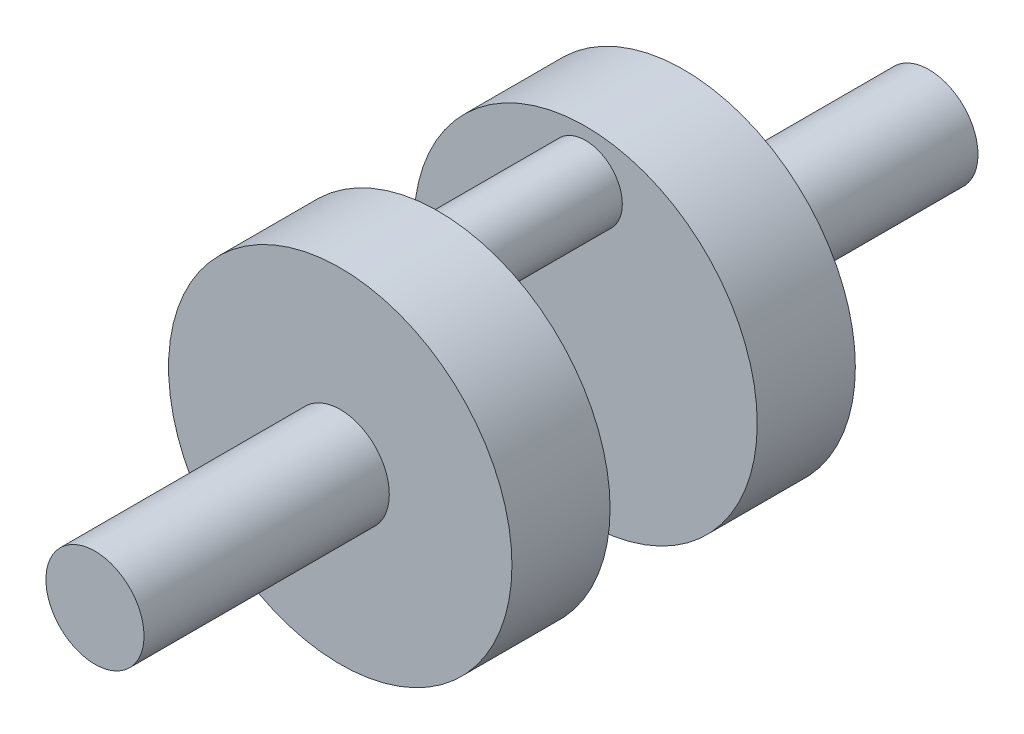
ISO-10303-21;
HEADER;
FILE_DESCRIPTION(('STEP AP214'),'2;1');
FILE_NAME('part.step','',(''),(''),'','','');
FILE_SCHEMA(('AUTOMOTIVE_DESIGN { 1 0 10303 214 1 1 1 1 }'));
ENDSEC;
DATA;
#1=APPLICATION_CONTEXT('core data for automotive mechanical design processes');
#2=APPLICATION_PROTOCOL_DEFINITION('international standard','automotive_design',2000,#1);
#3=PRODUCT_CONTEXT('',#1,'mechanical');
#4=PRODUCT('Part','Part','',(#3));
#5=PRODUCT_RELATED_PRODUCT_CATEGORY('part','',(#4));
#6=PRODUCT_DEFINITION_FORMATION('','',#4);
#7=PRODUCT_DEFINITION_CONTEXT('part definition',#1,'design');
#8=PRODUCT_DEFINITION('design','',#6,#7);
#9=PRODUCT_DEFINITION_SHAPE('','',#8);
#10=(LENGTH_UNIT() NAMED_UNIT(*) SI_UNIT(.MILLI.,.METRE.));
#11=(NAMED_UNIT(*) PLANE_ANGLE_UNIT() SI_UNIT($,.RADIAN.));
#12=(NAMED_UNIT(*) SI_UNIT($,.STERADIAN.) SOLID_ANGLE_UNIT());
#13=UNCERTAINTY_MEASURE_WITH_UNIT(LENGTH_MEASURE(1.E-05),#10,'distance_accuracy_value','');
#14=(GEOMETRIC_REPRESENTATION_CONTEXT(3) GLOBAL_UNCERTAINTY_ASSIGNED_CONTEXT((#13)) GLOBAL_UNIT_ASSIGNED_CONTEXT((#10,
#11,#12)) REPRESENTATION_CONTEXT('',''));
#15=CARTESIAN_POINT('',(0.,0.,0.));
#16=DIRECTION('',(0.,0.,1.));
#17=DIRECTION('',(1.,0.,0.));
#18=AXIS2_PLACEMENT_3D('',#15,#16,#17);
#19=CARTESIAN_POINT('',(0.,25.,-30.));
#20=DIRECTION('',(0.,0.,1.));
#21=DIRECTION('',(1.,0.,0.));
#22=AXIS2_PLACEMENT_3D('',#19,#20,#21);
#23=CYLINDRICAL_SURFACE('',#22,7.5);
#24=CARTESIAN_POINT('',(0.,25.,-30.));
#25=DIRECTION('',(0.,0.,1.));
#26=DIRECTION('',(1.,0.,0.));
#27=AXIS2_PLACEMENT_3D('',#24,#25,#26);
#28=CIRCLE('',#27,7.5);
#29=CARTESIAN_POINT('',(7.5,25.,-30.));
#30=VERTEX_POINT('',#29);
#31=EDGE_CURVE('E62',#30,#30,#28,.T.);
#32=ORIENTED_EDGE('',*,*,#31,.T.);
#33=EDGE_LOOP('',(#32));
#34=FACE_BOUND('',#33,.T.);
#35=CARTESIAN_POINT('',(0.,25.,0.));
#36=DIRECTION('',(0.,0.,1.));
#37=DIRECTION('',(1.,0.,0.));
#38=AXIS2_PLACEMENT_3D('',#35,#36,#37);
#39=CIRCLE('',#38,7.5);
#40=CARTESIAN_POINT('',(7.5,25.,0.));
#41=VERTEX_POINT('',#40);
#42=EDGE_CURVE('E11',#41,#41,#39,.T.);
#43=ORIENTED_EDGE('',*,*,#42,.F.);
#44=EDGE_LOOP('',(#43));
#45=FACE_BOUND('',#44,.T.);
#46=ADVANCED_FACE('F42',(#34,#45),#23,.T.);
#47=CARTESIAN_POINT('',(0.,0.,20.));
#48=DIRECTION('',(0.,0.,-1.));
#49=DIRECTION('',(-1.,0.,0.));
#50=AXIS2_PLACEMENT_3D('',#47,#48,#49);
#51=CYLINDRICAL_SURFACE('',#50,35.);
#52=CARTESIAN_POINT('',(0.,0.,20.));
#53=DIRECTION('',(0.,0.,1.));
#54=DIRECTION('',(1.,0.,0.));
#55=AXIS2_PLACEMENT_3D('',#52,#53,#54);
#56=CIRCLE('',#55,35.);
#57=CARTESIAN_POINT('',(35.,0.,20.));
#58=VERTEX_POINT('',#57);
#59=EDGE_CURVE('E48',#58,#58,#56,.T.);
#60=ORIENTED_EDGE('',*,*,#59,.F.);
#61=EDGE_LOOP('',(#60));
#62=FACE_BOUND('',#61,.T.);
#63=CARTESIAN_POINT('',(0.,0.,0.));
#64=DIRECTION('',(0.,0.,1.));
#65=DIRECTION('',(1.,0.,0.));
#66=AXIS2_PLACEMENT_3D('',#63,#64,#65);
#67=CIRCLE('',#66,35.);
#68=CARTESIAN_POINT('',(35.,0.,0.));
#69=VERTEX_POINT('',#68);
#70=EDGE_CURVE('E57',#69,#69,#67,.T.);
#71=ORIENTED_EDGE('',*,*,#70,.T.);
#72=EDGE_LOOP('',(#71));
#73=FACE_BOUND('',#72,.T.);
#74=ADVANCED_FACE('F96',(#62,#73),#51,.T.);
#75=CARTESIAN_POINT('',(0.,0.,20.));
#76=DIRECTION('',(0.,0.,1.));
#77=DIRECTION('',(1.,0.,0.));
#78=AXIS2_PLACEMENT_3D('',#75,#76,#77);
#79=PLANE('',#78);
#80=CARTESIAN_POINT('',(0.,0.,20.));
#81=DIRECTION('',(0.,0.,1.));
#82=DIRECTION('',(1.,0.,0.));
#83=AXIS2_PLACEMENT_3D('',#80,#81,#82);
#84=CIRCLE('',#83,10.);
#85=CARTESIAN_POINT('',(10.,0.,20.));
#86=VERTEX_POINT('',#85);
#87=EDGE_CURVE('E52',#86,#86,#84,.T.);
#88=ORIENTED_EDGE('',*,*,#87,.F.);
#89=EDGE_LOOP('',(#88));
#90=FACE_BOUND('',#89,.T.);
#91=ORIENTED_EDGE('',*,*,#59,.T.);
#92=EDGE_LOOP('',(#91));
#93=FACE_BOUND('',#92,.T.);
#94=ADVANCED_FACE('F100',(#90,#93),#79,.T.);
#95=CARTESIAN_POINT('',(0.,0.,0.));
#96=DIRECTION('',(0.,0.,1.));
#97=DIRECTION('',(1.,0.,0.));
#98=AXIS2_PLACEMENT_3D('',#95,#96,#97);
#99=PLANE('',#98);
#100=ORIENTED_EDGE('',*,*,#42,.T.);
#101=EDGE_LOOP('',(#100));
#102=FACE_BOUND('',#101,.T.);
#103=ORIENTED_EDGE('',*,*,#70,.F.);
#104=EDGE_LOOP('',(#103));
#105=FACE_BOUND('',#104,.T.);
#106=ADVANCED_FACE('F106',(#102,#105),#99,.F.);
#107=CARTESIAN_POINT('',(0.,0.,-50.));
#108=DIRECTION('',(0.,0.,1.));
#109=DIRECTION('',(1.,0.,0.));
#110=AXIS2_PLACEMENT_3D('',#107,#108,#109);
#111=CYLINDRICAL_SURFACE('',#110,35.);
#112=CARTESIAN_POINT('',(0.,0.,-50.));
#113=DIRECTION('',(0.,0.,1.));
#114=DIRECTION('',(1.,0.,0.));
#115=AXIS2_PLACEMENT_3D('',#112,#113,#114);
#116=CIRCLE('',#115,35.);
#117=CARTESIAN_POINT('',(35.,0.,-50.));
#118=VERTEX_POINT('',#117);
#119=EDGE_CURVE('E64',#118,#118,#116,.T.);
#120=ORIENTED_EDGE('',*,*,#119,.T.);
#121=EDGE_LOOP('',(#120));
#122=FACE_BOUND('',#121,.T.);
#123=CARTESIAN_POINT('',(0.,0.,-30.));
#124=DIRECTION('',(0.,0.,1.));
#125=DIRECTION('',(1.,0.,0.));
#126=AXIS2_PLACEMENT_3D('',#123,#124,#125);
#127=CIRCLE('',#126,35.);
#128=CARTESIAN_POINT('',(35.,0.,-30.));
#129=VERTEX_POINT('',#128);
#130=EDGE_CURVE('E68',#129,#129,#127,.T.);
#131=ORIENTED_EDGE('',*,*,#130,.F.);
#132=EDGE_LOOP('',(#131));
#133=FACE_BOUND('',#132,.T.);
#134=ADVANCED_FACE('F112',(#122,#133),#111,.T.);
#135=CARTESIAN_POINT('',(0.,0.,-50.));
#136=DIRECTION('',(0.,0.,1.));
#137=DIRECTION('',(1.,0.,0.));
#138=AXIS2_PLACEMENT_3D('',#135,#136,#137);
#139=PLANE('',#138);
#140=CARTESIAN_POINT('',(0.,0.,-50.));
#141=DIRECTION('',(0.,0.,1.));
#142=DIRECTION('',(1.,0.,0.));
#143=AXIS2_PLACEMENT_3D('',#140,#141,#142);
#144=CIRCLE('',#143,10.);
#145=CARTESIAN_POINT('',(10.,0.,-50.));
#146=VERTEX_POINT('',#145);
#147=EDGE_CURVE('E77',#146,#146,#144,.T.);
#148=ORIENTED_EDGE('',*,*,#147,.T.);
#149=EDGE_LOOP('',(#148));
#150=FACE_BOUND('',#149,.T.);
#151=ORIENTED_EDGE('',*,*,#119,.F.);
#152=EDGE_LOOP('',(#151));
#153=FACE_BOUND('',#152,.T.);
#154=ADVANCED_FACE('F116',(#150,#153),#139,.F.);
#155=CARTESIAN_POINT('',(0.,0.,-30.));
#156=DIRECTION('',(0.,0.,1.));
#157=DIRECTION('',(1.,0.,0.));
#158=AXIS2_PLACEMENT_3D('',#155,#156,#157);
#159=PLANE('',#158);
#160=ORIENTED_EDGE('',*,*,#31,.F.);
#161=EDGE_LOOP('',(#160));
#162=FACE_BOUND('',#161,.T.);
#163=ORIENTED_EDGE('',*,*,#130,.T.);
#164=EDGE_LOOP('',(#163));
#165=FACE_BOUND('',#164,.T.);
#166=ADVANCED_FACE('F117',(#162,#165),#159,.T.);
#167=CARTESIAN_POINT('',(0.,0.,70.));
#168=DIRECTION('',(0.,0.,-1.));
#169=DIRECTION('',(-1.,0.,0.));
#170=AXIS2_PLACEMENT_3D('',#167,#168,#169);
#171=CYLINDRICAL_SURFACE('',#170,10.);
#172=ORIENTED_EDGE('',*,*,#87,.T.);
#173=EDGE_LOOP('',(#172));
#174=FACE_BOUND('',#173,.T.);
#175=CARTESIAN_POINT('',(0.,0.,70.));
#176=DIRECTION('',(0.,0.,1.));
#177=DIRECTION('',(1.,0.,0.));
#178=AXIS2_PLACEMENT_3D('',#175,#176,#177);
#179=CIRCLE('',#178,10.);
#180=CARTESIAN_POINT('',(10.,0.,70.));
#181=VERTEX_POINT('',#180);
#182=EDGE_CURVE('E73',#181,#181,#179,.T.);
#183=ORIENTED_EDGE('',*,*,#182,.F.);
#184=EDGE_LOOP('',(#183));
#185=FACE_BOUND('',#184,.T.);
#186=ADVANCED_FACE('F120',(#174,#185),#171,.T.);
#187=CARTESIAN_POINT('',(0.,0.,70.));
#188=DIRECTION('',(0.,0.,1.));
#189=DIRECTION('',(1.,0.,0.));
#190=AXIS2_PLACEMENT_3D('',#187,#188,#189);
#191=PLANE('',#190);
#192=ORIENTED_EDGE('',*,*,#182,.T.);
#193=EDGE_LOOP('',(#192));
#194=FACE_BOUND('',#193,.T.);
#195=ADVANCED_FACE('F93',(#194),#191,.T.);
#196=CARTESIAN_POINT('',(0.,0.,-100.));
#197=DIRECTION('',(0.,0.,1.));
#198=DIRECTION('',(1.,0.,0.));
#199=AXIS2_PLACEMENT_3D('',#196,#197,#198);
#200=CYLINDRICAL_SURFACE('',#199,10.);
#201=CARTESIAN_POINT('',(0.,0.,-100.));
#202=DIRECTION('',(0.,0.,1.));
#203=DIRECTION('',(1.,0.,0.));
#204=AXIS2_PLACEMENT_3D('',#201,#202,#203);
#205=CIRCLE('',#204,10.);
#206=CARTESIAN_POINT('',(10.,0.,-100.));
#207=VERTEX_POINT('',#206);
#208=EDGE_CURVE('E80',#207,#207,#205,.T.);
#209=ORIENTED_EDGE('',*,*,#208,.T.);
#210=EDGE_LOOP('',(#209));
#211=FACE_BOUND('',#210,.T.);
#212=ORIENTED_EDGE('',*,*,#147,.F.);
#213=EDGE_LOOP('',(#212));
#214=FACE_BOUND('',#213,.T.);
#215=ADVANCED_FACE('F84',(#211,#214),#200,.T.);
#216=CARTESIAN_POINT('',(0.,0.,-100.));
#217=DIRECTION('',(0.,0.,1.));
#218=DIRECTION('',(1.,0.,0.));
#219=AXIS2_PLACEMENT_3D('',#216,#217,#218);
#220=PLANE('',#219);
#221=ORIENTED_EDGE('',*,*,#208,.F.);
#222=EDGE_LOOP('',(#221));
#223=FACE_BOUND('',#222,.T.);
#224=ADVANCED_FACE('F87',(#223),#220,.F.);
#225=CLOSED_SHELL('',(#46,#74,#94,#106,#134,#154,#166,#186,#195,#215,#224));
#226=MANIFOLD_SOLID_BREP('B2',#225);
#227=ADVANCED_BREP_SHAPE_REPRESENTATION('',(#18,#226),#14);
#228=SHAPE_DEFINITION_REPRESENTATION(#9,#227);
ENDSEC;
END-ISO-10303-21;
